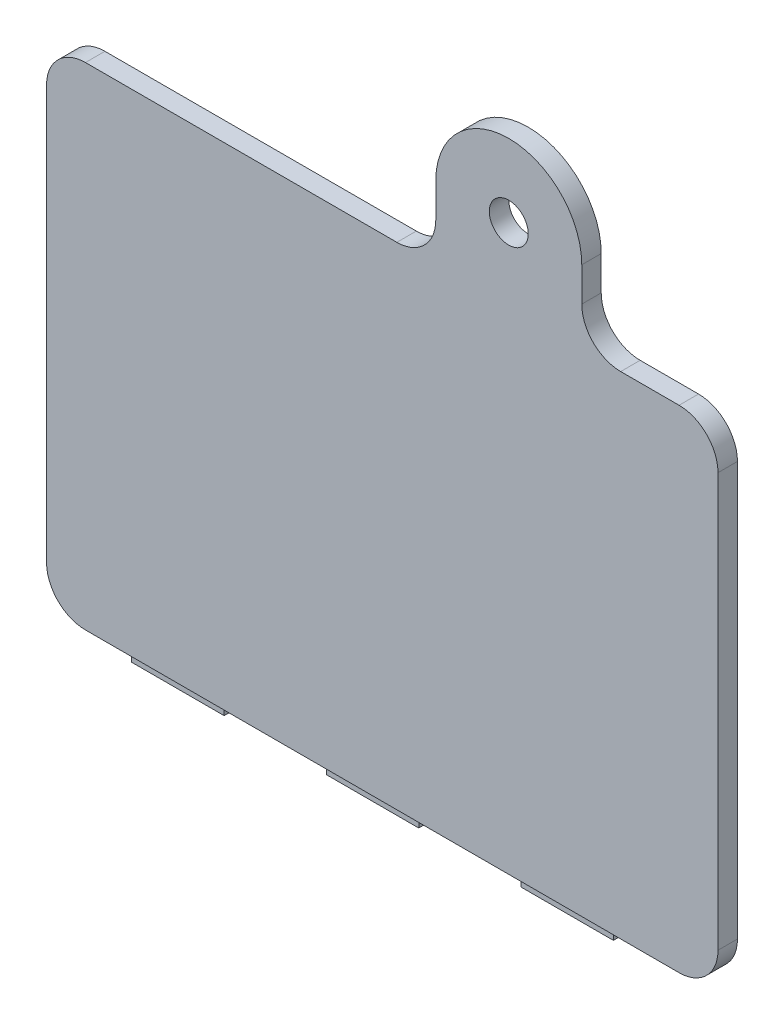
ISO-10303-21;
HEADER;
FILE_DESCRIPTION(('STEP AP214'),'2;1');
FILE_NAME('part.step','',(''),(''),'','','');
FILE_SCHEMA(('AUTOMOTIVE_DESIGN { 1 0 10303 214 1 1 1 1 }'));
ENDSEC;
DATA;
#1=APPLICATION_CONTEXT('core data for automotive mechanical design processes');
#2=APPLICATION_PROTOCOL_DEFINITION('international standard','automotive_design',2000,#1);
#3=PRODUCT_CONTEXT('',#1,'mechanical');
#4=PRODUCT('Part','Part','',(#3));
#5=PRODUCT_RELATED_PRODUCT_CATEGORY('part','',(#4));
#6=PRODUCT_DEFINITION_FORMATION('','',#4);
#7=PRODUCT_DEFINITION_CONTEXT('part definition',#1,'design');
#8=PRODUCT_DEFINITION('design','',#6,#7);
#9=PRODUCT_DEFINITION_SHAPE('','',#8);
#10=(LENGTH_UNIT() NAMED_UNIT(*) SI_UNIT(.MILLI.,.METRE.));
#11=(NAMED_UNIT(*) PLANE_ANGLE_UNIT() SI_UNIT($,.RADIAN.));
#12=(NAMED_UNIT(*) SI_UNIT($,.STERADIAN.) SOLID_ANGLE_UNIT());
#13=UNCERTAINTY_MEASURE_WITH_UNIT(LENGTH_MEASURE(1.E-05),#10,'distance_accuracy_value','');
#14=(GEOMETRIC_REPRESENTATION_CONTEXT(3) GLOBAL_UNCERTAINTY_ASSIGNED_CONTEXT((#13)) GLOBAL_UNIT_ASSIGNED_CONTEXT((#10,
#11,#12)) REPRESENTATION_CONTEXT('',''));
#15=CARTESIAN_POINT('',(0.,0.,0.));
#16=DIRECTION('',(0.,0.,1.));
#17=DIRECTION('',(1.,0.,0.));
#18=AXIS2_PLACEMENT_3D('',#15,#16,#17);
#19=CARTESIAN_POINT('',(0.,0.,0.));
#20=DIRECTION('',(0.,0.,1.));
#21=DIRECTION('',(1.,0.,0.));
#22=AXIS2_PLACEMENT_3D('',#19,#20,#21);
#23=PLANE('',#22);
#24=CARTESIAN_POINT('',(16.,32.75,0.));
#25=DIRECTION('',(0.,0.,1.));
#26=DIRECTION('',(1.,0.,0.));
#27=AXIS2_PLACEMENT_3D('',#24,#25,#26);
#28=CIRCLE('',#27,2.);
#29=CARTESIAN_POINT('',(18.,32.75,0.));
#30=VERTEX_POINT('',#29);
#31=EDGE_CURVE('E304',#30,#30,#28,.T.);
#32=ORIENTED_EDGE('',*,*,#31,.T.);
#33=EDGE_LOOP('',(#32));
#34=FACE_BOUND('',#33,.T.);
#35=DIRECTION('',(1.,0.,0.));
#36=VECTOR('',#35,1.);
#37=CARTESIAN_POINT('',(0.,-25.25,0.));
#38=LINE('',#37,#36);
#39=CARTESIAN_POINT('',(-27.5,-25.25,0.));
#40=VERTEX_POINT('',#39);
#41=CARTESIAN_POINT('',(-24.75,-25.25,0.));
#42=VERTEX_POINT('',#41);
#43=EDGE_CURVE('E342',#40,#42,#38,.T.);
#44=ORIENTED_EDGE('',*,*,#43,.F.);
#45=CARTESIAN_POINT('',(-27.5,-21.25,0.));
#46=DIRECTION('',(0.,0.,1.));
#47=DIRECTION('',(1.,0.,0.));
#48=AXIS2_PLACEMENT_3D('',#45,#46,#47);
#49=CIRCLE('',#48,4.);
#50=CARTESIAN_POINT('',(-31.5,-21.25,0.));
#51=VERTEX_POINT('',#50);
#52=EDGE_CURVE('E400',#40,#51,#49,.F.);
#53=ORIENTED_EDGE('',*,*,#52,.T.);
#54=DIRECTION('',(0.,-1.,0.));
#55=VECTOR('',#54,1.);
#56=CARTESIAN_POINT('',(-31.5,25.25,0.));
#57=LINE('',#56,#55);
#58=CARTESIAN_POINT('',(-31.5,21.25,0.));
#59=VERTEX_POINT('',#58);
#60=EDGE_CURVE('E458',#59,#51,#57,.T.);
#61=ORIENTED_EDGE('',*,*,#60,.F.);
#62=CARTESIAN_POINT('',(-27.5,21.25,0.));
#63=DIRECTION('',(0.,0.,1.));
#64=DIRECTION('',(1.,0.,0.));
#65=AXIS2_PLACEMENT_3D('',#62,#63,#64);
#66=CIRCLE('',#65,4.);
#67=CARTESIAN_POINT('',(-27.5,25.25,0.));
#68=VERTEX_POINT('',#67);
#69=EDGE_CURVE('E398',#59,#68,#66,.F.);
#70=ORIENTED_EDGE('',*,*,#69,.T.);
#71=DIRECTION('',(1.,0.,0.));
#72=VECTOR('',#71,1.);
#73=CARTESIAN_POINT('',(0.,25.25,0.));
#74=LINE('',#73,#72);
#75=CARTESIAN_POINT('',(4.49999999999999,25.25,0.));
#76=VERTEX_POINT('',#75);
#77=EDGE_CURVE('E338',#68,#76,#74,.T.);
#78=ORIENTED_EDGE('',*,*,#77,.T.);
#79=CARTESIAN_POINT('',(4.5,29.25,0.));
#80=DIRECTION('',(0.,0.,1.));
#81=DIRECTION('',(1.,0.,0.));
#82=AXIS2_PLACEMENT_3D('',#79,#80,#81);
#83=CIRCLE('',#82,4.);
#84=CARTESIAN_POINT('',(8.49999999999999,29.25,0.));
#85=VERTEX_POINT('',#84);
#86=EDGE_CURVE('E42',#76,#85,#83,.T.);
#87=ORIENTED_EDGE('',*,*,#86,.T.);
#88=DIRECTION('',(0.,1.,0.));
#89=VECTOR('',#88,1.);
#90=CARTESIAN_POINT('',(8.5,0.,0.));
#91=LINE('',#90,#89);
#92=CARTESIAN_POINT('',(8.49999999999999,32.75,0.));
#93=VERTEX_POINT('',#92);
#94=EDGE_CURVE('E336',#85,#93,#91,.T.);
#95=ORIENTED_EDGE('',*,*,#94,.T.);
#96=CARTESIAN_POINT('',(16.,32.75,0.));
#97=DIRECTION('',(0.,0.,1.));
#98=DIRECTION('',(1.,0.,0.));
#99=AXIS2_PLACEMENT_3D('',#96,#97,#98);
#100=CIRCLE('',#99,7.5);
#101=CARTESIAN_POINT('',(23.5,32.75,0.));
#102=VERTEX_POINT('',#101);
#103=EDGE_CURVE('E333',#93,#102,#100,.F.);
#104=ORIENTED_EDGE('',*,*,#103,.T.);
#105=DIRECTION('',(0.,-1.,0.));
#106=VECTOR('',#105,1.);
#107=CARTESIAN_POINT('',(23.5,0.,0.));
#108=LINE('',#107,#106);
#109=CARTESIAN_POINT('',(23.5,29.25,0.));
#110=VERTEX_POINT('',#109);
#111=EDGE_CURVE('E310',#102,#110,#108,.T.);
#112=ORIENTED_EDGE('',*,*,#111,.T.);
#113=CARTESIAN_POINT('',(27.5,29.25,0.));
#114=DIRECTION('',(0.,0.,1.));
#115=DIRECTION('',(1.,0.,0.));
#116=AXIS2_PLACEMENT_3D('',#113,#114,#115);
#117=CIRCLE('',#116,4.);
#118=CARTESIAN_POINT('',(27.5,25.25,0.));
#119=VERTEX_POINT('',#118);
#120=EDGE_CURVE('E422',#110,#119,#117,.T.);
#121=ORIENTED_EDGE('',*,*,#120,.T.);
#122=DIRECTION('',(1.,0.,0.));
#123=VECTOR('',#122,1.);
#124=CARTESIAN_POINT('',(0.,25.25,0.));
#125=LINE('',#124,#123);
#126=CARTESIAN_POINT('',(33.5,25.25,0.));
#127=VERTEX_POINT('',#126);
#128=EDGE_CURVE('E348',#119,#127,#125,.T.);
#129=ORIENTED_EDGE('',*,*,#128,.T.);
#130=CARTESIAN_POINT('',(33.5,21.25,0.));
#131=DIRECTION('',(0.,0.,1.));
#132=DIRECTION('',(1.,0.,0.));
#133=AXIS2_PLACEMENT_3D('',#130,#131,#132);
#134=CIRCLE('',#133,4.);
#135=CARTESIAN_POINT('',(37.5,21.25,0.));
#136=VERTEX_POINT('',#135);
#137=EDGE_CURVE('E57',#127,#136,#134,.F.);
#138=ORIENTED_EDGE('',*,*,#137,.T.);
#139=DIRECTION('',(0.,-1.,0.));
#140=VECTOR('',#139,1.);
#141=CARTESIAN_POINT('',(37.5,0.,0.));
#142=LINE('',#141,#140);
#143=CARTESIAN_POINT('',(37.5,-21.25,0.));
#144=VERTEX_POINT('',#143);
#145=EDGE_CURVE('E344',#136,#144,#142,.T.);
#146=ORIENTED_EDGE('',*,*,#145,.T.);
#147=CARTESIAN_POINT('',(33.5,-21.25,0.));
#148=DIRECTION('',(0.,0.,1.));
#149=DIRECTION('',(1.,0.,0.));
#150=AXIS2_PLACEMENT_3D('',#147,#148,#149);
#151=CIRCLE('',#150,4.);
#152=CARTESIAN_POINT('',(33.5,-25.25,0.));
#153=VERTEX_POINT('',#152);
#154=EDGE_CURVE('E49',#144,#153,#151,.F.);
#155=ORIENTED_EDGE('',*,*,#154,.T.);
#156=CARTESIAN_POINT('',(24.75,-25.25,0.));
#157=VERTEX_POINT('',#156);
#158=EDGE_CURVE('E341',#157,#153,#38,.T.);
#159=ORIENTED_EDGE('',*,*,#158,.F.);
#160=DIRECTION('',(0.,1.,0.));
#161=VECTOR('',#160,1.);
#162=CARTESIAN_POINT('',(24.75,-27.75,0.));
#163=LINE('',#162,#161);
#164=CARTESIAN_POINT('',(24.75,-20.75,0.));
#165=VERTEX_POINT('',#164);
#166=EDGE_CURVE('E467',#157,#165,#163,.T.);
#167=ORIENTED_EDGE('',*,*,#166,.T.);
#168=DIRECTION('',(-1.,0.,0.));
#169=VECTOR('',#168,1.);
#170=CARTESIAN_POINT('',(15.25,-20.75,0.));
#171=LINE('',#170,#169);
#172=CARTESIAN_POINT('',(15.25,-20.75,0.));
#173=VERTEX_POINT('',#172);
#174=EDGE_CURVE('E356',#165,#173,#171,.T.);
#175=ORIENTED_EDGE('',*,*,#174,.T.);
#176=DIRECTION('',(0.,1.,0.));
#177=VECTOR('',#176,1.);
#178=CARTESIAN_POINT('',(15.25,-27.75,0.));
#179=LINE('',#178,#177);
#180=CARTESIAN_POINT('',(15.25,-25.25,0.));
#181=VERTEX_POINT('',#180);
#182=EDGE_CURVE('E464',#181,#173,#179,.T.);
#183=ORIENTED_EDGE('',*,*,#182,.F.);
#184=CARTESIAN_POINT('',(4.75000000000001,-25.25,0.));
#185=VERTEX_POINT('',#184);
#186=EDGE_CURVE('E565',#185,#181,#38,.T.);
#187=ORIENTED_EDGE('',*,*,#186,.F.);
#188=DIRECTION('',(0.,1.,0.));
#189=VECTOR('',#188,1.);
#190=CARTESIAN_POINT('',(4.75000000000001,-27.75,0.));
#191=LINE('',#190,#189);
#192=CARTESIAN_POINT('',(4.75000000000001,-20.75,0.));
#193=VERTEX_POINT('',#192);
#194=EDGE_CURVE('E305',#185,#193,#191,.T.);
#195=ORIENTED_EDGE('',*,*,#194,.T.);
#196=DIRECTION('',(-1.,0.,0.));
#197=VECTOR('',#196,1.);
#198=CARTESIAN_POINT('',(0.,-20.75,0.));
#199=LINE('',#198,#197);
#200=CARTESIAN_POINT('',(-4.74999999999998,-20.75,0.));
#201=VERTEX_POINT('',#200);
#202=EDGE_CURVE('E359',#193,#201,#199,.T.);
#203=ORIENTED_EDGE('',*,*,#202,.T.);
#204=DIRECTION('',(0.,1.,0.));
#205=VECTOR('',#204,1.);
#206=CARTESIAN_POINT('',(-4.74999999999998,-27.75,0.));
#207=LINE('',#206,#205);
#208=CARTESIAN_POINT('',(-4.74999999999998,-25.25,0.));
#209=VERTEX_POINT('',#208);
#210=EDGE_CURVE('E301',#209,#201,#207,.T.);
#211=ORIENTED_EDGE('',*,*,#210,.F.);
#212=CARTESIAN_POINT('',(-15.25,-25.25,0.));
#213=VERTEX_POINT('',#212);
#214=EDGE_CURVE('E556',#213,#209,#38,.T.);
#215=ORIENTED_EDGE('',*,*,#214,.F.);
#216=DIRECTION('',(0.,1.,0.));
#217=VECTOR('',#216,1.);
#218=CARTESIAN_POINT('',(-15.25,-27.75,0.));
#219=LINE('',#218,#217);
#220=CARTESIAN_POINT('',(-15.25,-20.75,0.));
#221=VERTEX_POINT('',#220);
#222=EDGE_CURVE('E277',#213,#221,#219,.T.);
#223=ORIENTED_EDGE('',*,*,#222,.T.);
#224=DIRECTION('',(-1.,0.,0.));
#225=VECTOR('',#224,1.);
#226=CARTESIAN_POINT('',(0.,-20.75,0.));
#227=LINE('',#226,#225);
#228=CARTESIAN_POINT('',(-24.75,-20.75,0.));
#229=VERTEX_POINT('',#228);
#230=EDGE_CURVE('E362',#221,#229,#227,.T.);
#231=ORIENTED_EDGE('',*,*,#230,.T.);
#232=DIRECTION('',(0.,1.,0.));
#233=VECTOR('',#232,1.);
#234=CARTESIAN_POINT('',(-24.75,-27.75,0.));
#235=LINE('',#234,#233);
#236=EDGE_CURVE('E273',#42,#229,#235,.T.);
#237=ORIENTED_EDGE('',*,*,#236,.F.);
#238=EDGE_LOOP('',(#44,#53,#61,#70,#78,#87,#95,#104,#112,#121,#129,#138,#146,#155,#159,#167,
#175,#183,#187,#195,#203,#211,#215,#223,#231,#237));
#239=FACE_BOUND('',#238,.T.);
#240=ADVANCED_FACE('F34',(#34,#239),#23,.F.);
#241=CARTESIAN_POINT('',(16.,32.75,2.));
#242=DIRECTION('',(0.,0.,-1.));
#243=DIRECTION('',(-1.,0.,0.));
#244=AXIS2_PLACEMENT_3D('',#241,#242,#243);
#245=CYLINDRICAL_SURFACE('',#244,7.5);
#246=ORIENTED_EDGE('',*,*,#103,.F.);
#247=DIRECTION('',(0.,0.,-1.));
#248=VECTOR('',#247,1.);
#249=CARTESIAN_POINT('',(8.49999999999999,32.75,2.));
#250=LINE('',#249,#248);
#251=CARTESIAN_POINT('',(8.49999999999999,32.75,2.));
#252=VERTEX_POINT('',#251);
#253=EDGE_CURVE('E353',#252,#93,#250,.T.);
#254=ORIENTED_EDGE('',*,*,#253,.F.);
#255=CARTESIAN_POINT('',(16.,32.75,2.));
#256=DIRECTION('',(0.,0.,1.));
#257=DIRECTION('',(1.,0.,0.));
#258=AXIS2_PLACEMENT_3D('',#255,#256,#257);
#259=CIRCLE('',#258,7.5);
#260=CARTESIAN_POINT('',(23.5,32.75,2.));
#261=VERTEX_POINT('',#260);
#262=EDGE_CURVE('E309',#252,#261,#259,.F.);
#263=ORIENTED_EDGE('',*,*,#262,.T.);
#264=DIRECTION('',(0.,0.,-1.));
#265=VECTOR('',#264,1.);
#266=CARTESIAN_POINT('',(23.5,32.75,2.));
#267=LINE('',#266,#265);
#268=EDGE_CURVE('E330',#261,#102,#267,.T.);
#269=ORIENTED_EDGE('',*,*,#268,.T.);
#270=EDGE_LOOP('',(#246,#254,#263,#269));
#271=FACE_BOUND('',#270,.T.);
#272=ADVANCED_FACE('F495',(#271),#245,.T.);
#273=CARTESIAN_POINT('',(8.5,0.,2.));
#274=DIRECTION('',(-1.,0.,0.));
#275=DIRECTION('',(0.,-1.,0.));
#276=AXIS2_PLACEMENT_3D('',#273,#274,#275);
#277=PLANE('',#276);
#278=ORIENTED_EDGE('',*,*,#94,.F.);
#279=DIRECTION('',(0.,0.,-1.));
#280=VECTOR('',#279,1.);
#281=CARTESIAN_POINT('',(8.49999999999999,29.25,2.));
#282=LINE('',#281,#280);
#283=CARTESIAN_POINT('',(8.49999999999999,29.25,2.));
#284=VERTEX_POINT('',#283);
#285=EDGE_CURVE('E420',#85,#284,#282,.F.);
#286=ORIENTED_EDGE('',*,*,#285,.T.);
#287=DIRECTION('',(0.,1.,0.));
#288=VECTOR('',#287,1.);
#289=CARTESIAN_POINT('',(8.5,0.,2.));
#290=LINE('',#289,#288);
#291=EDGE_CURVE('E313',#284,#252,#290,.T.);
#292=ORIENTED_EDGE('',*,*,#291,.T.);
#293=ORIENTED_EDGE('',*,*,#253,.T.);
#294=EDGE_LOOP('',(#278,#286,#292,#293));
#295=FACE_BOUND('',#294,.T.);
#296=ADVANCED_FACE('F432',(#295),#277,.T.);
#297=CARTESIAN_POINT('',(0.,25.25,2.));
#298=DIRECTION('',(0.,1.,0.));
#299=DIRECTION('',(-1.,0.,0.));
#300=AXIS2_PLACEMENT_3D('',#297,#298,#299);
#301=PLANE('',#300);
#302=ORIENTED_EDGE('',*,*,#77,.F.);
#303=DIRECTION('',(0.,0.,1.));
#304=VECTOR('',#303,1.);
#305=CARTESIAN_POINT('',(-27.5,25.25,2.));
#306=LINE('',#305,#304);
#307=CARTESIAN_POINT('',(-27.5,25.25,2.));
#308=VERTEX_POINT('',#307);
#309=EDGE_CURVE('E405',#68,#308,#306,.T.);
#310=ORIENTED_EDGE('',*,*,#309,.T.);
#311=DIRECTION('',(1.,0.,0.));
#312=VECTOR('',#311,1.);
#313=CARTESIAN_POINT('',(0.,25.25,2.));
#314=LINE('',#313,#312);
#315=CARTESIAN_POINT('',(4.49999999999999,25.25,2.));
#316=VERTEX_POINT('',#315);
#317=EDGE_CURVE('E315',#308,#316,#314,.T.);
#318=ORIENTED_EDGE('',*,*,#317,.T.);
#319=DIRECTION('',(0.,0.,-1.));
#320=VECTOR('',#319,1.);
#321=CARTESIAN_POINT('',(4.49999999999999,25.25,0.));
#322=LINE('',#321,#320);
#323=EDGE_CURVE('E402',#316,#76,#322,.T.);
#324=ORIENTED_EDGE('',*,*,#323,.T.);
#325=EDGE_LOOP('',(#302,#310,#318,#324));
#326=FACE_BOUND('',#325,.T.);
#327=ADVANCED_FACE('F445',(#326),#301,.T.);
#328=CARTESIAN_POINT('',(0.,-25.25,2.));
#329=DIRECTION('',(0.,1.,0.));
#330=DIRECTION('',(0.,0.,1.));
#331=AXIS2_PLACEMENT_3D('',#328,#329,#330);
#332=PLANE('',#331);
#333=DIRECTION('',(1.,0.,0.));
#334=VECTOR('',#333,1.);
#335=CARTESIAN_POINT('',(0.,-25.25,2.));
#336=LINE('',#335,#334);
#337=CARTESIAN_POINT('',(-27.5,-25.25,2.));
#338=VERTEX_POINT('',#337);
#339=CARTESIAN_POINT('',(33.5,-25.25,2.));
#340=VERTEX_POINT('',#339);
#341=EDGE_CURVE('E318',#338,#340,#336,.T.);
#342=ORIENTED_EDGE('',*,*,#341,.F.);
#343=DIRECTION('',(0.,0.,1.));
#344=VECTOR('',#343,1.);
#345=CARTESIAN_POINT('',(-27.5,-25.25,2.));
#346=LINE('',#345,#344);
#347=EDGE_CURVE('E394',#338,#40,#346,.F.);
#348=ORIENTED_EDGE('',*,*,#347,.T.);
#349=ORIENTED_EDGE('',*,*,#43,.T.);
#350=EDGE_CURVE('E345',#42,#213,#38,.T.);
#351=ORIENTED_EDGE('',*,*,#350,.T.);
#352=ORIENTED_EDGE('',*,*,#214,.T.);
#353=EDGE_CURVE('E346',#209,#185,#38,.T.);
#354=ORIENTED_EDGE('',*,*,#353,.T.);
#355=ORIENTED_EDGE('',*,*,#186,.T.);
#356=EDGE_CURVE('E560',#181,#157,#38,.T.);
#357=ORIENTED_EDGE('',*,*,#356,.T.);
#358=ORIENTED_EDGE('',*,*,#158,.T.);
#359=DIRECTION('',(0.,0.,-1.));
#360=VECTOR('',#359,1.);
#361=CARTESIAN_POINT('',(33.5,-25.25,2.));
#362=LINE('',#361,#360);
#363=EDGE_CURVE('E392',#153,#340,#362,.F.);
#364=ORIENTED_EDGE('',*,*,#363,.T.);
#365=EDGE_LOOP('',(#342,#348,#349,#351,#352,#354,#355,#357,#358,#364));
#366=FACE_BOUND('',#365,.T.);
#367=ADVANCED_FACE('F518',(#366),#332,.F.);
#368=CARTESIAN_POINT('',(37.5,0.,2.));
#369=DIRECTION('',(1.,0.,0.));
#370=DIRECTION('',(0.,0.,-1.));
#371=AXIS2_PLACEMENT_3D('',#368,#369,#370);
#372=PLANE('',#371);
#373=DIRECTION('',(0.,-1.,0.));
#374=VECTOR('',#373,1.);
#375=CARTESIAN_POINT('',(37.5,0.,2.));
#376=LINE('',#375,#374);
#377=CARTESIAN_POINT('',(37.5,21.25,2.));
#378=VERTEX_POINT('',#377);
#379=CARTESIAN_POINT('',(37.5,-21.25,2.));
#380=VERTEX_POINT('',#379);
#381=EDGE_CURVE('E321',#378,#380,#376,.T.);
#382=ORIENTED_EDGE('',*,*,#381,.T.);
#383=DIRECTION('',(0.,0.,-1.));
#384=VECTOR('',#383,1.);
#385=CARTESIAN_POINT('',(37.5,-21.25,0.));
#386=LINE('',#385,#384);
#387=EDGE_CURVE('E410',#380,#144,#386,.T.);
#388=ORIENTED_EDGE('',*,*,#387,.T.);
#389=ORIENTED_EDGE('',*,*,#145,.F.);
#390=DIRECTION('',(0.,0.,-1.));
#391=VECTOR('',#390,1.);
#392=CARTESIAN_POINT('',(37.5,21.25,2.));
#393=LINE('',#392,#391);
#394=EDGE_CURVE('E408',#136,#378,#393,.F.);
#395=ORIENTED_EDGE('',*,*,#394,.T.);
#396=EDGE_LOOP('',(#382,#388,#389,#395));
#397=FACE_BOUND('',#396,.T.);
#398=ADVANCED_FACE('F514',(#397),#372,.T.);
#399=CARTESIAN_POINT('',(0.,25.25,2.));
#400=DIRECTION('',(0.,1.,0.));
#401=DIRECTION('',(0.,0.,1.));
#402=AXIS2_PLACEMENT_3D('',#399,#400,#401);
#403=PLANE('',#402);
#404=ORIENTED_EDGE('',*,*,#128,.F.);
#405=DIRECTION('',(0.,0.,-1.));
#406=VECTOR('',#405,1.);
#407=CARTESIAN_POINT('',(27.5,25.25,2.));
#408=LINE('',#407,#406);
#409=CARTESIAN_POINT('',(27.5,25.25,2.));
#410=VERTEX_POINT('',#409);
#411=EDGE_CURVE('E418',#119,#410,#408,.F.);
#412=ORIENTED_EDGE('',*,*,#411,.T.);
#413=DIRECTION('',(1.,0.,0.));
#414=VECTOR('',#413,1.);
#415=CARTESIAN_POINT('',(0.,25.25,2.));
#416=LINE('',#415,#414);
#417=CARTESIAN_POINT('',(33.5,25.25,2.));
#418=VERTEX_POINT('',#417);
#419=EDGE_CURVE('E324',#410,#418,#416,.T.);
#420=ORIENTED_EDGE('',*,*,#419,.T.);
#421=DIRECTION('',(0.,0.,-1.));
#422=VECTOR('',#421,1.);
#423=CARTESIAN_POINT('',(33.5,25.25,2.));
#424=LINE('',#423,#422);
#425=EDGE_CURVE('E415',#418,#127,#424,.T.);
#426=ORIENTED_EDGE('',*,*,#425,.T.);
#427=EDGE_LOOP('',(#404,#412,#420,#426));
#428=FACE_BOUND('',#427,.T.);
#429=ADVANCED_FACE('F511',(#428),#403,.T.);
#430=CARTESIAN_POINT('',(16.,32.75,2.));
#431=DIRECTION('',(0.,0.,-1.));
#432=DIRECTION('',(-1.,0.,0.));
#433=AXIS2_PLACEMENT_3D('',#430,#431,#432);
#434=CYLINDRICAL_SURFACE('',#433,2.);
#435=CARTESIAN_POINT('',(16.,32.75,2.));
#436=DIRECTION('',(0.,0.,1.));
#437=DIRECTION('',(1.,0.,0.));
#438=AXIS2_PLACEMENT_3D('',#435,#436,#437);
#439=CIRCLE('',#438,2.);
#440=CARTESIAN_POINT('',(18.,32.75,2.));
#441=VERTEX_POINT('',#440);
#442=EDGE_CURVE('E306',#441,#441,#439,.T.);
#443=ORIENTED_EDGE('',*,*,#442,.T.);
#444=EDGE_LOOP('',(#443));
#445=FACE_BOUND('',#444,.T.);
#446=ORIENTED_EDGE('',*,*,#31,.F.);
#447=EDGE_LOOP('',(#446));
#448=FACE_BOUND('',#447,.T.);
#449=ADVANCED_FACE('F509',(#445,#448),#434,.F.);
#450=CARTESIAN_POINT('',(23.5,0.,2.));
#451=DIRECTION('',(1.,0.,0.));
#452=DIRECTION('',(0.,0.,-1.));
#453=AXIS2_PLACEMENT_3D('',#450,#451,#452);
#454=PLANE('',#453);
#455=DIRECTION('',(0.,-1.,0.));
#456=VECTOR('',#455,1.);
#457=CARTESIAN_POINT('',(23.5,0.,2.));
#458=LINE('',#457,#456);
#459=CARTESIAN_POINT('',(23.5,29.25,2.));
#460=VERTEX_POINT('',#459);
#461=EDGE_CURVE('E327',#261,#460,#458,.T.);
#462=ORIENTED_EDGE('',*,*,#461,.T.);
#463=DIRECTION('',(0.,0.,-1.));
#464=VECTOR('',#463,1.);
#465=CARTESIAN_POINT('',(23.5,29.25,0.));
#466=LINE('',#465,#464);
#467=EDGE_CURVE('E412',#460,#110,#466,.T.);
#468=ORIENTED_EDGE('',*,*,#467,.T.);
#469=ORIENTED_EDGE('',*,*,#111,.F.);
#470=ORIENTED_EDGE('',*,*,#268,.F.);
#471=EDGE_LOOP('',(#462,#468,#469,#470));
#472=FACE_BOUND('',#471,.T.);
#473=ADVANCED_FACE('F506',(#472),#454,.T.);
#474=CARTESIAN_POINT('',(0.,0.,2.));
#475=DIRECTION('',(0.,0.,1.));
#476=DIRECTION('',(1.,0.,0.));
#477=AXIS2_PLACEMENT_3D('',#474,#475,#476);
#478=PLANE('',#477);
#479=DIRECTION('',(0.,1.,0.));
#480=VECTOR('',#479,1.);
#481=CARTESIAN_POINT('',(-31.5,25.25,2.));
#482=LINE('',#481,#480);
#483=CARTESIAN_POINT('',(-31.5,-21.25,2.));
#484=VERTEX_POINT('',#483);
#485=CARTESIAN_POINT('',(-31.5,21.25,2.));
#486=VERTEX_POINT('',#485);
#487=EDGE_CURVE('E452',#484,#486,#482,.T.);
#488=ORIENTED_EDGE('',*,*,#487,.F.);
#489=CARTESIAN_POINT('',(-27.5,-21.25,2.));
#490=DIRECTION('',(0.,0.,1.));
#491=DIRECTION('',(1.,0.,0.));
#492=AXIS2_PLACEMENT_3D('',#489,#490,#491);
#493=CIRCLE('',#492,4.);
#494=EDGE_CURVE('E390',#484,#338,#493,.T.);
#495=ORIENTED_EDGE('',*,*,#494,.T.);
#496=ORIENTED_EDGE('',*,*,#341,.T.);
#497=CARTESIAN_POINT('',(33.5,-21.25,2.));
#498=DIRECTION('',(0.,0.,1.));
#499=DIRECTION('',(1.,0.,0.));
#500=AXIS2_PLACEMENT_3D('',#497,#498,#499);
#501=CIRCLE('',#500,4.);
#502=EDGE_CURVE('E386',#340,#380,#501,.T.);
#503=ORIENTED_EDGE('',*,*,#502,.T.);
#504=ORIENTED_EDGE('',*,*,#381,.F.);
#505=CARTESIAN_POINT('',(33.5,21.25,2.));
#506=DIRECTION('',(0.,0.,1.));
#507=DIRECTION('',(1.,0.,0.));
#508=AXIS2_PLACEMENT_3D('',#505,#506,#507);
#509=CIRCLE('',#508,4.);
#510=EDGE_CURVE('E384',#378,#418,#509,.T.);
#511=ORIENTED_EDGE('',*,*,#510,.T.);
#512=ORIENTED_EDGE('',*,*,#419,.F.);
#513=CARTESIAN_POINT('',(27.5,29.25,2.));
#514=DIRECTION('',(0.,0.,1.));
#515=DIRECTION('',(1.,0.,0.));
#516=AXIS2_PLACEMENT_3D('',#513,#514,#515);
#517=CIRCLE('',#516,4.);
#518=EDGE_CURVE('E424',#410,#460,#517,.F.);
#519=ORIENTED_EDGE('',*,*,#518,.T.);
#520=ORIENTED_EDGE('',*,*,#461,.F.);
#521=ORIENTED_EDGE('',*,*,#262,.F.);
#522=ORIENTED_EDGE('',*,*,#291,.F.);
#523=CARTESIAN_POINT('',(4.5,29.25,2.));
#524=DIRECTION('',(0.,0.,1.));
#525=DIRECTION('',(1.,0.,0.));
#526=AXIS2_PLACEMENT_3D('',#523,#524,#525);
#527=CIRCLE('',#526,4.);
#528=EDGE_CURVE('E11',#284,#316,#527,.F.);
#529=ORIENTED_EDGE('',*,*,#528,.T.);
#530=ORIENTED_EDGE('',*,*,#317,.F.);
#531=CARTESIAN_POINT('',(-27.5,21.25,2.));
#532=DIRECTION('',(0.,0.,1.));
#533=DIRECTION('',(1.,0.,0.));
#534=AXIS2_PLACEMENT_3D('',#531,#532,#533);
#535=CIRCLE('',#534,4.);
#536=EDGE_CURVE('E388',#308,#486,#535,.T.);
#537=ORIENTED_EDGE('',*,*,#536,.T.);
#538=EDGE_LOOP('',(#488,#495,#496,#503,#504,#511,#512,#519,#520,#521,#522,#529,#530,#537));
#539=FACE_BOUND('',#538,.T.);
#540=ORIENTED_EDGE('',*,*,#442,.F.);
#541=EDGE_LOOP('',(#540));
#542=FACE_BOUND('',#541,.T.);
#543=ADVANCED_FACE('F441',(#539,#542),#478,.T.);
#544=CARTESIAN_POINT('',(4.75000000000001,-27.75,0.));
#545=DIRECTION('',(-1.,0.,0.));
#546=DIRECTION('',(0.,0.,1.));
#547=AXIS2_PLACEMENT_3D('',#544,#545,#546);
#548=PLANE('',#547);
#549=DIRECTION('',(0.,1.,0.));
#550=VECTOR('',#549,1.);
#551=CARTESIAN_POINT('',(4.75000000000001,-27.75,-2.));
#552=LINE('',#551,#550);
#553=CARTESIAN_POINT('',(4.75000000000001,-27.75,-2.));
#554=VERTEX_POINT('',#553);
#555=CARTESIAN_POINT('',(4.75000000000001,-22.75,-2.));
#556=VERTEX_POINT('',#555);
#557=EDGE_CURVE('E290',#554,#556,#552,.T.);
#558=ORIENTED_EDGE('',*,*,#557,.T.);
#559=DIRECTION('',(0.,0.707106781186552,0.707106781186543));
#560=VECTOR('',#559,1.);
#561=CARTESIAN_POINT('',(4.75000000000001,-24.25,-3.50000000000001));
#562=LINE('',#561,#560);
#563=EDGE_CURVE('E372',#556,#193,#562,.T.);
#564=ORIENTED_EDGE('',*,*,#563,.T.);
#565=ORIENTED_EDGE('',*,*,#194,.F.);
#566=CARTESIAN_POINT('',(4.75000000000001,-27.75,0.));
#567=VERTEX_POINT('',#566);
#568=EDGE_CURVE('E300',#567,#185,#191,.T.);
#569=ORIENTED_EDGE('',*,*,#568,.F.);
#570=DIRECTION('',(0.,0.,1.));
#571=VECTOR('',#570,1.);
#572=CARTESIAN_POINT('',(4.75000000000001,-27.75,0.));
#573=LINE('',#572,#571);
#574=EDGE_CURVE('E281',#554,#567,#573,.T.);
#575=ORIENTED_EDGE('',*,*,#574,.F.);
#576=EDGE_LOOP('',(#558,#564,#565,#569,#575));
#577=FACE_BOUND('',#576,.T.);
#578=ADVANCED_FACE('F759',(#577),#548,.F.);
#579=CARTESIAN_POINT('',(4.75000000000001,-27.75,0.));
#580=DIRECTION('',(0.,0.,-1.));
#581=DIRECTION('',(-1.,0.,0.));
#582=AXIS2_PLACEMENT_3D('',#579,#580,#581);
#583=PLANE('',#582);
#584=ORIENTED_EDGE('',*,*,#353,.F.);
#585=CARTESIAN_POINT('',(-4.74999999999998,-27.75,0.));
#586=VERTEX_POINT('',#585);
#587=EDGE_CURVE('E297',#586,#209,#207,.T.);
#588=ORIENTED_EDGE('',*,*,#587,.F.);
#589=DIRECTION('',(-1.,0.,0.));
#590=VECTOR('',#589,1.);
#591=CARTESIAN_POINT('',(4.75000000000001,-27.75,0.));
#592=LINE('',#591,#590);
#593=EDGE_CURVE('E284',#567,#586,#592,.T.);
#594=ORIENTED_EDGE('',*,*,#593,.F.);
#595=ORIENTED_EDGE('',*,*,#568,.T.);
#596=EDGE_LOOP('',(#584,#588,#594,#595));
#597=FACE_BOUND('',#596,.T.);
#598=ADVANCED_FACE('F751',(#597),#583,.F.);
#599=CARTESIAN_POINT('',(-4.74999999999998,-27.75,0.));
#600=DIRECTION('',(1.,0.,0.));
#601=DIRECTION('',(0.,0.,-1.));
#602=AXIS2_PLACEMENT_3D('',#599,#600,#601);
#603=PLANE('',#602);
#604=ORIENTED_EDGE('',*,*,#210,.T.);
#605=DIRECTION('',(0.,-0.707106781186552,-0.707106781186543));
#606=VECTOR('',#605,1.);
#607=CARTESIAN_POINT('',(-4.74999999999998,-24.25,-3.50000000000002));
#608=LINE('',#607,#606);
#609=CARTESIAN_POINT('',(-4.74999999999998,-22.75,-2.));
#610=VERTEX_POINT('',#609);
#611=EDGE_CURVE('E370',#201,#610,#608,.T.);
#612=ORIENTED_EDGE('',*,*,#611,.T.);
#613=DIRECTION('',(0.,1.,0.));
#614=VECTOR('',#613,1.);
#615=CARTESIAN_POINT('',(-4.74999999999998,-27.75,-2.));
#616=LINE('',#615,#614);
#617=CARTESIAN_POINT('',(-4.74999999999998,-27.75,-2.));
#618=VERTEX_POINT('',#617);
#619=EDGE_CURVE('E294',#618,#610,#616,.T.);
#620=ORIENTED_EDGE('',*,*,#619,.F.);
#621=DIRECTION('',(0.,0.,-1.));
#622=VECTOR('',#621,1.);
#623=CARTESIAN_POINT('',(-4.74999999999998,-27.75,0.));
#624=LINE('',#623,#622);
#625=EDGE_CURVE('E286',#586,#618,#624,.T.);
#626=ORIENTED_EDGE('',*,*,#625,.F.);
#627=ORIENTED_EDGE('',*,*,#587,.T.);
#628=EDGE_LOOP('',(#604,#612,#620,#626,#627));
#629=FACE_BOUND('',#628,.T.);
#630=ADVANCED_FACE('F742',(#629),#603,.F.);
#631=CARTESIAN_POINT('',(4.75000000000001,-27.75,-2.));
#632=DIRECTION('',(0.,0.,1.));
#633=DIRECTION('',(1.,0.,0.));
#634=AXIS2_PLACEMENT_3D('',#631,#632,#633);
#635=PLANE('',#634);
#636=DIRECTION('',(1.,0.,0.));
#637=VECTOR('',#636,1.);
#638=CARTESIAN_POINT('',(4.75000000000001,-22.75,-2.));
#639=LINE('',#638,#637);
#640=EDGE_CURVE('E280',#610,#556,#639,.T.);
#641=ORIENTED_EDGE('',*,*,#640,.T.);
#642=ORIENTED_EDGE('',*,*,#557,.F.);
#643=DIRECTION('',(1.,0.,0.));
#644=VECTOR('',#643,1.);
#645=CARTESIAN_POINT('',(4.75000000000001,-27.75,-2.));
#646=LINE('',#645,#644);
#647=EDGE_CURVE('E288',#618,#554,#646,.T.);
#648=ORIENTED_EDGE('',*,*,#647,.F.);
#649=ORIENTED_EDGE('',*,*,#619,.T.);
#650=EDGE_LOOP('',(#641,#642,#648,#649));
#651=FACE_BOUND('',#650,.T.);
#652=ADVANCED_FACE('F733',(#651),#635,.F.);
#653=CARTESIAN_POINT('',(0.,-27.75,0.));
#654=DIRECTION('',(0.,1.,0.));
#655=DIRECTION('',(0.,0.,1.));
#656=AXIS2_PLACEMENT_3D('',#653,#654,#655);
#657=PLANE('',#656);
#658=ORIENTED_EDGE('',*,*,#574,.T.);
#659=ORIENTED_EDGE('',*,*,#593,.T.);
#660=ORIENTED_EDGE('',*,*,#625,.T.);
#661=ORIENTED_EDGE('',*,*,#647,.T.);
#662=EDGE_LOOP('',(#658,#659,#660,#661));
#663=FACE_BOUND('',#662,.T.);
#664=ADVANCED_FACE('F725',(#663),#657,.F.);
#665=CARTESIAN_POINT('',(-15.25,-27.75,0.));
#666=DIRECTION('',(0.,0.,-1.));
#667=DIRECTION('',(-1.,0.,0.));
#668=AXIS2_PLACEMENT_3D('',#665,#666,#667);
#669=PLANE('',#668);
#670=CARTESIAN_POINT('',(-15.25,-27.75,0.));
#671=VERTEX_POINT('',#670);
#672=EDGE_CURVE('E278',#671,#213,#219,.T.);
#673=ORIENTED_EDGE('',*,*,#672,.T.);
#674=ORIENTED_EDGE('',*,*,#350,.F.);
#675=CARTESIAN_POINT('',(-24.75,-27.75,0.));
#676=VERTEX_POINT('',#675);
#677=EDGE_CURVE('E274',#676,#42,#235,.T.);
#678=ORIENTED_EDGE('',*,*,#677,.F.);
#679=DIRECTION('',(-1.,0.,0.));
#680=VECTOR('',#679,1.);
#681=CARTESIAN_POINT('',(-15.25,-27.75,0.));
#682=LINE('',#681,#680);
#683=EDGE_CURVE('E261',#671,#676,#682,.T.);
#684=ORIENTED_EDGE('',*,*,#683,.F.);
#685=EDGE_LOOP('',(#673,#674,#678,#684));
#686=FACE_BOUND('',#685,.T.);
#687=ADVANCED_FACE('F717',(#686),#669,.F.);
#688=CARTESIAN_POINT('',(-15.25,-27.75,0.));
#689=DIRECTION('',(-1.,0.,0.));
#690=DIRECTION('',(0.,0.,1.));
#691=AXIS2_PLACEMENT_3D('',#688,#689,#690);
#692=PLANE('',#691);
#693=DIRECTION('',(0.,1.,0.));
#694=VECTOR('',#693,1.);
#695=CARTESIAN_POINT('',(-15.25,-27.75,-2.));
#696=LINE('',#695,#694);
#697=CARTESIAN_POINT('',(-15.25,-27.75,-2.));
#698=VERTEX_POINT('',#697);
#699=CARTESIAN_POINT('',(-15.25,-22.75,-2.));
#700=VERTEX_POINT('',#699);
#701=EDGE_CURVE('E266',#698,#700,#696,.T.);
#702=ORIENTED_EDGE('',*,*,#701,.T.);
#703=DIRECTION('',(0.,0.707106781186552,0.707106781186543));
#704=VECTOR('',#703,1.);
#705=CARTESIAN_POINT('',(-15.25,-24.25,-3.50000000000002));
#706=LINE('',#705,#704);
#707=EDGE_CURVE('E367',#700,#221,#706,.T.);
#708=ORIENTED_EDGE('',*,*,#707,.T.);
#709=ORIENTED_EDGE('',*,*,#222,.F.);
#710=ORIENTED_EDGE('',*,*,#672,.F.);
#711=DIRECTION('',(0.,0.,1.));
#712=VECTOR('',#711,1.);
#713=CARTESIAN_POINT('',(-15.25,-27.75,0.));
#714=LINE('',#713,#712);
#715=EDGE_CURVE('E253',#698,#671,#714,.T.);
#716=ORIENTED_EDGE('',*,*,#715,.F.);
#717=EDGE_LOOP('',(#702,#708,#709,#710,#716));
#718=FACE_BOUND('',#717,.T.);
#719=ADVANCED_FACE('F542',(#718),#692,.F.);
#720=CARTESIAN_POINT('',(-24.75,-27.75,0.));
#721=DIRECTION('',(1.,0.,0.));
#722=DIRECTION('',(0.,0.,-1.));
#723=AXIS2_PLACEMENT_3D('',#720,#721,#722);
#724=PLANE('',#723);
#725=ORIENTED_EDGE('',*,*,#236,.T.);
#726=DIRECTION('',(0.,-0.707106781186552,-0.707106781186543));
#727=VECTOR('',#726,1.);
#728=CARTESIAN_POINT('',(-24.75,-24.25,-3.50000000000002));
#729=LINE('',#728,#727);
#730=CARTESIAN_POINT('',(-24.75,-22.75,-2.));
#731=VERTEX_POINT('',#730);
#732=EDGE_CURVE('E365',#229,#731,#729,.T.);
#733=ORIENTED_EDGE('',*,*,#732,.T.);
#734=DIRECTION('',(0.,1.,0.));
#735=VECTOR('',#734,1.);
#736=CARTESIAN_POINT('',(-24.75,-27.75,-2.));
#737=LINE('',#736,#735);
#738=CARTESIAN_POINT('',(-24.75,-27.75,-2.));
#739=VERTEX_POINT('',#738);
#740=EDGE_CURVE('E270',#739,#731,#737,.T.);
#741=ORIENTED_EDGE('',*,*,#740,.F.);
#742=DIRECTION('',(0.,0.,-1.));
#743=VECTOR('',#742,1.);
#744=CARTESIAN_POINT('',(-24.75,-27.75,0.));
#745=LINE('',#744,#743);
#746=EDGE_CURVE('E263',#676,#739,#745,.T.);
#747=ORIENTED_EDGE('',*,*,#746,.F.);
#748=ORIENTED_EDGE('',*,*,#677,.T.);
#749=EDGE_LOOP('',(#725,#733,#741,#747,#748));
#750=FACE_BOUND('',#749,.T.);
#751=ADVANCED_FACE('F553',(#750),#724,.F.);
#752=CARTESIAN_POINT('',(-15.25,-27.75,-2.));
#753=DIRECTION('',(0.,0.,1.));
#754=DIRECTION('',(1.,0.,0.));
#755=AXIS2_PLACEMENT_3D('',#752,#753,#754);
#756=PLANE('',#755);
#757=DIRECTION('',(1.,0.,0.));
#758=VECTOR('',#757,1.);
#759=CARTESIAN_POINT('',(-15.25,-22.75,-2.));
#760=LINE('',#759,#758);
#761=EDGE_CURVE('E251',#731,#700,#760,.T.);
#762=ORIENTED_EDGE('',*,*,#761,.T.);
#763=ORIENTED_EDGE('',*,*,#701,.F.);
#764=DIRECTION('',(1.,0.,0.));
#765=VECTOR('',#764,1.);
#766=CARTESIAN_POINT('',(-15.25,-27.75,-2.));
#767=LINE('',#766,#765);
#768=EDGE_CURVE('E265',#739,#698,#767,.T.);
#769=ORIENTED_EDGE('',*,*,#768,.F.);
#770=ORIENTED_EDGE('',*,*,#740,.T.);
#771=EDGE_LOOP('',(#762,#763,#769,#770));
#772=FACE_BOUND('',#771,.T.);
#773=ADVANCED_FACE('F549',(#772),#756,.F.);
#774=CARTESIAN_POINT('',(0.,-27.75,0.));
#775=DIRECTION('',(0.,1.,0.));
#776=DIRECTION('',(0.,0.,1.));
#777=AXIS2_PLACEMENT_3D('',#774,#775,#776);
#778=PLANE('',#777);
#779=ORIENTED_EDGE('',*,*,#715,.T.);
#780=ORIENTED_EDGE('',*,*,#683,.T.);
#781=ORIENTED_EDGE('',*,*,#746,.T.);
#782=ORIENTED_EDGE('',*,*,#768,.T.);
#783=EDGE_LOOP('',(#779,#780,#781,#782));
#784=FACE_BOUND('',#783,.T.);
#785=ADVANCED_FACE('F687',(#784),#778,.F.);
#786=CARTESIAN_POINT('',(15.25,-27.75,0.));
#787=DIRECTION('',(0.,0.,-1.));
#788=DIRECTION('',(-1.,0.,0.));
#789=AXIS2_PLACEMENT_3D('',#786,#787,#788);
#790=PLANE('',#789);
#791=CARTESIAN_POINT('',(24.75,-27.75,0.));
#792=VERTEX_POINT('',#791);
#793=EDGE_CURVE('E255',#792,#157,#163,.T.);
#794=ORIENTED_EDGE('',*,*,#793,.T.);
#795=ORIENTED_EDGE('',*,*,#356,.F.);
#796=CARTESIAN_POINT('',(15.25,-27.75,0.));
#797=VERTEX_POINT('',#796);
#798=EDGE_CURVE('E466',#797,#181,#179,.T.);
#799=ORIENTED_EDGE('',*,*,#798,.F.);
#800=DIRECTION('',(-1.,0.,0.));
#801=VECTOR('',#800,1.);
#802=CARTESIAN_POINT('',(15.25,-27.75,0.));
#803=LINE('',#802,#801);
#804=EDGE_CURVE('E242',#792,#797,#803,.T.);
#805=ORIENTED_EDGE('',*,*,#804,.F.);
#806=EDGE_LOOP('',(#794,#795,#799,#805));
#807=FACE_BOUND('',#806,.T.);
#808=ADVANCED_FACE('F679',(#807),#790,.F.);
#809=CARTESIAN_POINT('',(15.25,-27.75,0.));
#810=DIRECTION('',(1.,0.,0.));
#811=DIRECTION('',(0.,0.,-1.));
#812=AXIS2_PLACEMENT_3D('',#809,#810,#811);
#813=PLANE('',#812);
#814=ORIENTED_EDGE('',*,*,#182,.T.);
#815=DIRECTION('',(0.,0.707106781186552,0.707106781186543));
#816=VECTOR('',#815,1.);
#817=CARTESIAN_POINT('',(15.25,-24.25,-3.50000000000002));
#818=LINE('',#817,#816);
#819=CARTESIAN_POINT('',(15.25,-22.75,-2.));
#820=VERTEX_POINT('',#819);
#821=EDGE_CURVE('E250',#173,#820,#818,.F.);
#822=ORIENTED_EDGE('',*,*,#821,.T.);
#823=DIRECTION('',(0.,1.,0.));
#824=VECTOR('',#823,1.);
#825=CARTESIAN_POINT('',(15.25,-27.75,-2.));
#826=LINE('',#825,#824);
#827=CARTESIAN_POINT('',(15.25,-27.75,-2.));
#828=VERTEX_POINT('',#827);
#829=EDGE_CURVE('E230',#828,#820,#826,.T.);
#830=ORIENTED_EDGE('',*,*,#829,.F.);
#831=DIRECTION('',(0.,0.,-1.));
#832=VECTOR('',#831,1.);
#833=CARTESIAN_POINT('',(15.25,-27.75,0.));
#834=LINE('',#833,#832);
#835=EDGE_CURVE('E237',#797,#828,#834,.T.);
#836=ORIENTED_EDGE('',*,*,#835,.F.);
#837=ORIENTED_EDGE('',*,*,#798,.T.);
#838=EDGE_LOOP('',(#814,#822,#830,#836,#837));
#839=FACE_BOUND('',#838,.T.);
#840=ADVANCED_FACE('F248',(#839),#813,.F.);
#841=CARTESIAN_POINT('',(15.25,-27.75,-2.));
#842=DIRECTION('',(0.,0.,1.));
#843=DIRECTION('',(1.,0.,0.));
#844=AXIS2_PLACEMENT_3D('',#841,#842,#843);
#845=PLANE('',#844);
#846=DIRECTION('',(1.,0.,0.));
#847=VECTOR('',#846,1.);
#848=CARTESIAN_POINT('',(15.25,-22.75,-2.));
#849=LINE('',#848,#847);
#850=CARTESIAN_POINT('',(24.75,-22.75,-2.));
#851=VERTEX_POINT('',#850);
#852=EDGE_CURVE('E246',#820,#851,#849,.T.);
#853=ORIENTED_EDGE('',*,*,#852,.T.);
#854=DIRECTION('',(0.,1.,0.));
#855=VECTOR('',#854,1.);
#856=CARTESIAN_POINT('',(24.75,-27.75,-2.));
#857=LINE('',#856,#855);
#858=CARTESIAN_POINT('',(24.75,-27.75,-2.));
#859=VERTEX_POINT('',#858);
#860=EDGE_CURVE('E233',#859,#851,#857,.T.);
#861=ORIENTED_EDGE('',*,*,#860,.F.);
#862=DIRECTION('',(1.,0.,0.));
#863=VECTOR('',#862,1.);
#864=CARTESIAN_POINT('',(15.25,-27.75,-2.));
#865=LINE('',#864,#863);
#866=EDGE_CURVE('E226',#828,#859,#865,.T.);
#867=ORIENTED_EDGE('',*,*,#866,.F.);
#868=ORIENTED_EDGE('',*,*,#829,.T.);
#869=EDGE_LOOP('',(#853,#861,#867,#868));
#870=FACE_BOUND('',#869,.T.);
#871=ADVANCED_FACE('F228',(#870),#845,.F.);
#872=CARTESIAN_POINT('',(24.75,-27.75,0.));
#873=DIRECTION('',(-1.,0.,0.));
#874=DIRECTION('',(0.,0.,1.));
#875=AXIS2_PLACEMENT_3D('',#872,#873,#874);
#876=PLANE('',#875);
#877=ORIENTED_EDGE('',*,*,#860,.T.);
#878=DIRECTION('',(0.,-0.707106781186552,-0.707106781186543));
#879=VECTOR('',#878,1.);
#880=CARTESIAN_POINT('',(24.75,-24.25,-3.50000000000002));
#881=LINE('',#880,#879);
#882=EDGE_CURVE('E376',#851,#165,#881,.F.);
#883=ORIENTED_EDGE('',*,*,#882,.T.);
#884=ORIENTED_EDGE('',*,*,#166,.F.);
#885=ORIENTED_EDGE('',*,*,#793,.F.);
#886=DIRECTION('',(0.,0.,1.));
#887=VECTOR('',#886,1.);
#888=CARTESIAN_POINT('',(24.75,-27.75,0.));
#889=LINE('',#888,#887);
#890=EDGE_CURVE('E236',#859,#792,#889,.T.);
#891=ORIENTED_EDGE('',*,*,#890,.F.);
#892=EDGE_LOOP('',(#877,#883,#884,#885,#891));
#893=FACE_BOUND('',#892,.T.);
#894=ADVANCED_FACE('F478',(#893),#876,.F.);
#895=CARTESIAN_POINT('',(0.,-27.75,0.));
#896=DIRECTION('',(0.,-1.,0.));
#897=DIRECTION('',(0.,0.,-1.));
#898=AXIS2_PLACEMENT_3D('',#895,#896,#897);
#899=PLANE('',#898);
#900=ORIENTED_EDGE('',*,*,#835,.T.);
#901=ORIENTED_EDGE('',*,*,#866,.T.);
#902=ORIENTED_EDGE('',*,*,#890,.T.);
#903=ORIENTED_EDGE('',*,*,#804,.T.);
#904=EDGE_LOOP('',(#900,#901,#902,#903));
#905=FACE_BOUND('',#904,.T.);
#906=ADVANCED_FACE('F240',(#905),#899,.T.);
#907=CARTESIAN_POINT('',(0.,-20.75,0.));
#908=DIRECTION('',(0.,-0.707106781186542,0.707106781186552));
#909=DIRECTION('',(-1.,0.,0.));
#910=AXIS2_PLACEMENT_3D('',#907,#908,#909);
#911=PLANE('',#910);
#912=ORIENTED_EDGE('',*,*,#707,.F.);
#913=ORIENTED_EDGE('',*,*,#761,.F.);
#914=ORIENTED_EDGE('',*,*,#732,.F.);
#915=ORIENTED_EDGE('',*,*,#230,.F.);
#916=EDGE_LOOP('',(#912,#913,#914,#915));
#917=FACE_BOUND('',#916,.T.);
#918=ADVANCED_FACE('F490',(#917),#911,.F.);
#919=CARTESIAN_POINT('',(0.,-20.75,0.));
#920=DIRECTION('',(0.,-0.707106781186542,0.707106781186552));
#921=DIRECTION('',(-1.,0.,0.));
#922=AXIS2_PLACEMENT_3D('',#919,#920,#921);
#923=PLANE('',#922);
#924=ORIENTED_EDGE('',*,*,#563,.F.);
#925=ORIENTED_EDGE('',*,*,#640,.F.);
#926=ORIENTED_EDGE('',*,*,#611,.F.);
#927=ORIENTED_EDGE('',*,*,#202,.F.);
#928=EDGE_LOOP('',(#924,#925,#926,#927));
#929=FACE_BOUND('',#928,.T.);
#930=ADVANCED_FACE('F482',(#929),#923,.F.);
#931=CARTESIAN_POINT('',(0.,-20.75,0.));
#932=DIRECTION('',(0.,0.707106781186542,-0.707106781186552));
#933=DIRECTION('',(1.,0.,0.));
#934=AXIS2_PLACEMENT_3D('',#931,#932,#933);
#935=PLANE('',#934);
#936=ORIENTED_EDGE('',*,*,#882,.F.);
#937=ORIENTED_EDGE('',*,*,#852,.F.);
#938=ORIENTED_EDGE('',*,*,#821,.F.);
#939=ORIENTED_EDGE('',*,*,#174,.F.);
#940=EDGE_LOOP('',(#936,#937,#938,#939));
#941=FACE_BOUND('',#940,.T.);
#942=ADVANCED_FACE('F480',(#941),#935,.T.);
#943=CARTESIAN_POINT('',(-31.5,25.25,-2.001));
#944=DIRECTION('',(1.,0.,0.));
#945=DIRECTION('',(0.,1.,0.));
#946=AXIS2_PLACEMENT_3D('',#943,#944,#945);
#947=PLANE('',#946);
#948=ORIENTED_EDGE('',*,*,#60,.T.);
#949=DIRECTION('',(0.,0.,1.));
#950=VECTOR('',#949,1.);
#951=CARTESIAN_POINT('',(-31.5,-21.25,-2.001));
#952=LINE('',#951,#950);
#953=EDGE_CURVE('E381',#51,#484,#952,.T.);
#954=ORIENTED_EDGE('',*,*,#953,.T.);
#955=ORIENTED_EDGE('',*,*,#487,.T.);
#956=DIRECTION('',(0.,0.,1.));
#957=VECTOR('',#956,1.);
#958=CARTESIAN_POINT('',(-31.5,21.25,0.));
#959=LINE('',#958,#957);
#960=EDGE_CURVE('E379',#486,#59,#959,.F.);
#961=ORIENTED_EDGE('',*,*,#960,.T.);
#962=EDGE_LOOP('',(#948,#954,#955,#961));
#963=FACE_BOUND('',#962,.T.);
#964=ADVANCED_FACE('F455',(#963),#947,.F.);
#965=CARTESIAN_POINT('',(-27.5,-21.25,-2.001));
#966=DIRECTION('',(0.,0.,1.));
#967=DIRECTION('',(1.,0.,0.));
#968=AXIS2_PLACEMENT_3D('',#965,#966,#967);
#969=CYLINDRICAL_SURFACE('',#968,4.);
#970=ORIENTED_EDGE('',*,*,#52,.F.);
#971=ORIENTED_EDGE('',*,*,#347,.F.);
#972=ORIENTED_EDGE('',*,*,#494,.F.);
#973=ORIENTED_EDGE('',*,*,#953,.F.);
#974=EDGE_LOOP('',(#970,#971,#972,#973));
#975=FACE_BOUND('',#974,.T.);
#976=ADVANCED_FACE('F488',(#975),#969,.T.);
#977=CARTESIAN_POINT('',(-27.5,21.25,2.));
#978=DIRECTION('',(0.,0.,-1.));
#979=DIRECTION('',(-1.,0.,0.));
#980=AXIS2_PLACEMENT_3D('',#977,#978,#979);
#981=CYLINDRICAL_SURFACE('',#980,4.);
#982=ORIENTED_EDGE('',*,*,#69,.F.);
#983=ORIENTED_EDGE('',*,*,#960,.F.);
#984=ORIENTED_EDGE('',*,*,#536,.F.);
#985=ORIENTED_EDGE('',*,*,#309,.F.);
#986=EDGE_LOOP('',(#982,#983,#984,#985));
#987=FACE_BOUND('',#986,.T.);
#988=ADVANCED_FACE('F449',(#987),#981,.T.);
#989=CARTESIAN_POINT('',(33.5,-21.25,2.));
#990=DIRECTION('',(0.,0.,1.));
#991=DIRECTION('',(1.,0.,0.));
#992=AXIS2_PLACEMENT_3D('',#989,#990,#991);
#993=CYLINDRICAL_SURFACE('',#992,4.);
#994=ORIENTED_EDGE('',*,*,#502,.F.);
#995=ORIENTED_EDGE('',*,*,#363,.F.);
#996=ORIENTED_EDGE('',*,*,#154,.F.);
#997=ORIENTED_EDGE('',*,*,#387,.F.);
#998=EDGE_LOOP('',(#994,#995,#996,#997));
#999=FACE_BOUND('',#998,.T.);
#1000=ADVANCED_FACE('F569',(#999),#993,.T.);
#1001=CARTESIAN_POINT('',(27.5,29.25,2.));
#1002=DIRECTION('',(0.,0.,1.));
#1003=DIRECTION('',(1.,0.,0.));
#1004=AXIS2_PLACEMENT_3D('',#1001,#1002,#1003);
#1005=CYLINDRICAL_SURFACE('',#1004,4.);
#1006=ORIENTED_EDGE('',*,*,#518,.F.);
#1007=ORIENTED_EDGE('',*,*,#411,.F.);
#1008=ORIENTED_EDGE('',*,*,#120,.F.);
#1009=ORIENTED_EDGE('',*,*,#467,.F.);
#1010=EDGE_LOOP('',(#1006,#1007,#1008,#1009));
#1011=FACE_BOUND('',#1010,.T.);
#1012=ADVANCED_FACE('F580',(#1011),#1005,.F.);
#1013=CARTESIAN_POINT('',(4.5,29.25,2.));
#1014=DIRECTION('',(0.,0.,1.));
#1015=DIRECTION('',(1.,0.,0.));
#1016=AXIS2_PLACEMENT_3D('',#1013,#1014,#1015);
#1017=CYLINDRICAL_SURFACE('',#1016,4.);
#1018=ORIENTED_EDGE('',*,*,#528,.F.);
#1019=ORIENTED_EDGE('',*,*,#285,.F.);
#1020=ORIENTED_EDGE('',*,*,#86,.F.);
#1021=ORIENTED_EDGE('',*,*,#323,.F.);
#1022=EDGE_LOOP('',(#1018,#1019,#1020,#1021));
#1023=FACE_BOUND('',#1022,.T.);
#1024=ADVANCED_FACE('F437',(#1023),#1017,.F.);
#1025=CARTESIAN_POINT('',(33.5,21.25,2.));
#1026=DIRECTION('',(0.,0.,-1.));
#1027=DIRECTION('',(-1.,0.,0.));
#1028=AXIS2_PLACEMENT_3D('',#1025,#1026,#1027);
#1029=CYLINDRICAL_SURFACE('',#1028,4.);
#1030=ORIENTED_EDGE('',*,*,#510,.F.);
#1031=ORIENTED_EDGE('',*,*,#394,.F.);
#1032=ORIENTED_EDGE('',*,*,#137,.F.);
#1033=ORIENTED_EDGE('',*,*,#425,.F.);
#1034=EDGE_LOOP('',(#1030,#1031,#1032,#1033));
#1035=FACE_BOUND('',#1034,.T.);
#1036=ADVANCED_FACE('F36',(#1035),#1029,.T.);
#1037=CLOSED_SHELL('',(#240,#272,#296,#327,#367,#398,#429,#449,#473,#543,#578,#598,#630,#652,
#664,#687,#719,#751,#773,#785,#808,#840,#871,#894,#906,#918,#930,#942,#964,#976,#988,#1000,
#1012,#1024,#1036));
#1038=MANIFOLD_SOLID_BREP('B2',#1037);
#1039=ADVANCED_BREP_SHAPE_REPRESENTATION('',(#18,#1038),#14);
#1040=SHAPE_DEFINITION_REPRESENTATION(#9,#1039);
ENDSEC;
END-ISO-10303-21;
